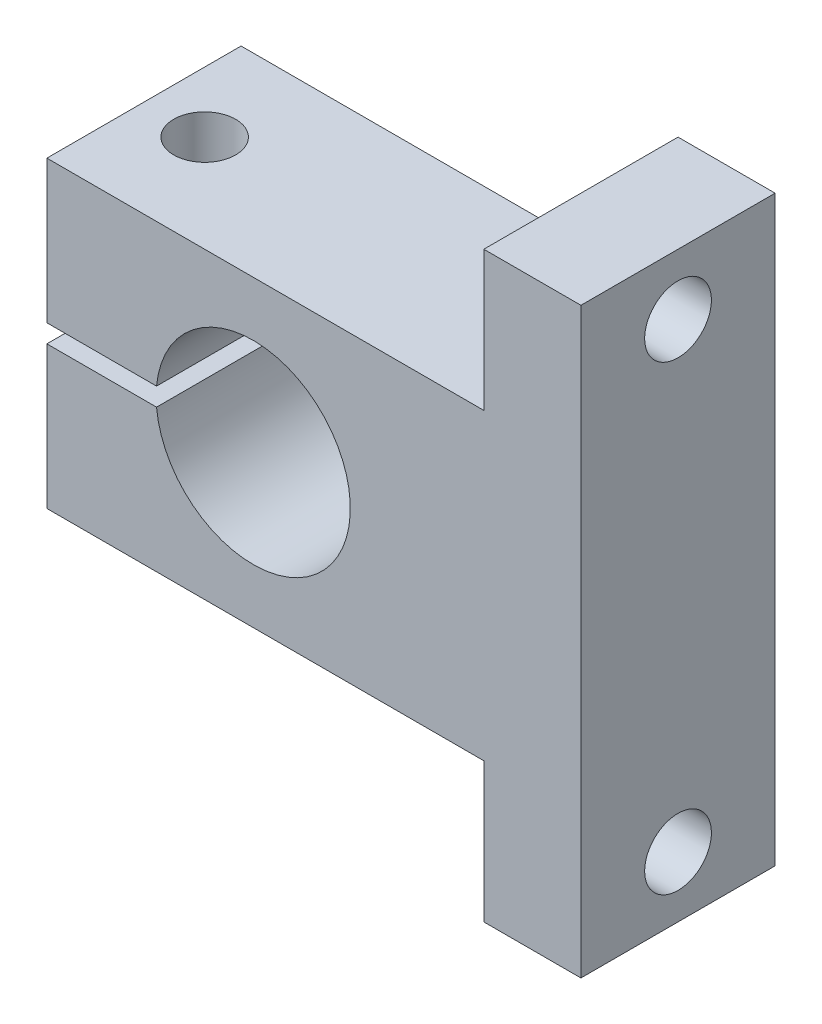
ISO-10303-21;
HEADER;
FILE_DESCRIPTION(('STEP AP214'),'2;1');
FILE_NAME('part.step','',(''),(''),'','','');
FILE_SCHEMA(('AUTOMOTIVE_DESIGN { 1 0 10303 214 1 1 1 1 }'));
ENDSEC;
DATA;
#1=APPLICATION_CONTEXT('core data for automotive mechanical design processes');
#2=APPLICATION_PROTOCOL_DEFINITION('international standard','automotive_design',2000,#1);
#3=PRODUCT_CONTEXT('',#1,'mechanical');
#4=PRODUCT('Part','Part','',(#3));
#5=PRODUCT_RELATED_PRODUCT_CATEGORY('part','',(#4));
#6=PRODUCT_DEFINITION_FORMATION('','',#4);
#7=PRODUCT_DEFINITION_CONTEXT('part definition',#1,'design');
#8=PRODUCT_DEFINITION('design','',#6,#7);
#9=PRODUCT_DEFINITION_SHAPE('','',#8);
#10=(LENGTH_UNIT() NAMED_UNIT(*) SI_UNIT(.MILLI.,.METRE.));
#11=(NAMED_UNIT(*) PLANE_ANGLE_UNIT() SI_UNIT($,.RADIAN.));
#12=(NAMED_UNIT(*) SI_UNIT($,.STERADIAN.) SOLID_ANGLE_UNIT());
#13=UNCERTAINTY_MEASURE_WITH_UNIT(LENGTH_MEASURE(1.E-05),#10,'distance_accuracy_value','');
#14=(GEOMETRIC_REPRESENTATION_CONTEXT(3) GLOBAL_UNCERTAINTY_ASSIGNED_CONTEXT((#13)) GLOBAL_UNIT_ASSIGNED_CONTEXT((#10,
#11,#12)) REPRESENTATION_CONTEXT('',''));
#15=CARTESIAN_POINT('',(0.,0.,0.));
#16=DIRECTION('',(0.,0.,1.));
#17=DIRECTION('',(1.,0.,0.));
#18=AXIS2_PLACEMENT_3D('',#15,#16,#17);
#19=CARTESIAN_POINT('',(-8.,0.,16.));
#20=DIRECTION('',(0.,1.,0.));
#21=DIRECTION('',(0.,0.,1.));
#22=AXIS2_PLACEMENT_3D('',#19,#20,#21);
#23=PLANE('',#22);
#24=DIRECTION('',(1.,0.,0.));
#25=VECTOR('',#24,1.);
#26=CARTESIAN_POINT('',(-8.,0.,0.));
#27=LINE('',#26,#25);
#28=CARTESIAN_POINT('',(-8.,0.,0.));
#29=VERTEX_POINT('',#28);
#30=CARTESIAN_POINT('',(0.,0.,0.));
#31=VERTEX_POINT('',#30);
#32=EDGE_CURVE('E170',#29,#31,#27,.T.);
#33=ORIENTED_EDGE('',*,*,#32,.T.);
#34=DIRECTION('',(0.,0.,-1.));
#35=VECTOR('',#34,1.);
#36=CARTESIAN_POINT('',(0.,0.,16.));
#37=LINE('',#36,#35);
#38=CARTESIAN_POINT('',(0.,0.,16.));
#39=VERTEX_POINT('',#38);
#40=EDGE_CURVE('E11',#39,#31,#37,.T.);
#41=ORIENTED_EDGE('',*,*,#40,.F.);
#42=DIRECTION('',(1.,0.,0.));
#43=VECTOR('',#42,1.);
#44=CARTESIAN_POINT('',(-8.,0.,16.));
#45=LINE('',#44,#43);
#46=CARTESIAN_POINT('',(-8.,0.,16.));
#47=VERTEX_POINT('',#46);
#48=EDGE_CURVE('E205',#47,#39,#45,.T.);
#49=ORIENTED_EDGE('',*,*,#48,.F.);
#50=DIRECTION('',(0.,0.,-1.));
#51=VECTOR('',#50,1.);
#52=CARTESIAN_POINT('',(-8.,0.,16.));
#53=LINE('',#52,#51);
#54=EDGE_CURVE('E166',#47,#29,#53,.T.);
#55=ORIENTED_EDGE('',*,*,#54,.T.);
#56=EDGE_LOOP('',(#33,#41,#49,#55));
#57=FACE_BOUND('',#56,.T.);
#58=ADVANCED_FACE('F45',(#57),#23,.F.);
#59=CARTESIAN_POINT('',(0.,0.,16.));
#60=DIRECTION('',(-1.,0.,0.));
#61=DIRECTION('',(0.,0.,1.));
#62=AXIS2_PLACEMENT_3D('',#59,#60,#61);
#63=PLANE('',#62);
#64=CARTESIAN_POINT('',(0.,5.,8.));
#65=DIRECTION('',(-1.,0.,0.));
#66=DIRECTION('',(0.,-1.,0.));
#67=AXIS2_PLACEMENT_3D('',#64,#65,#66);
#68=CIRCLE('',#67,2.75);
#69=CARTESIAN_POINT('',(0.,2.25,8.));
#70=VERTEX_POINT('',#69);
#71=EDGE_CURVE('E488',#70,#70,#68,.T.);
#72=ORIENTED_EDGE('',*,*,#71,.T.);
#73=EDGE_LOOP('',(#72));
#74=FACE_BOUND('',#73,.T.);
#75=CARTESIAN_POINT('',(0.,43.,8.));
#76=DIRECTION('',(-1.,0.,0.));
#77=DIRECTION('',(0.,-1.,0.));
#78=AXIS2_PLACEMENT_3D('',#75,#76,#77);
#79=CIRCLE('',#78,2.75);
#80=CARTESIAN_POINT('',(0.,40.25,8.));
#81=VERTEX_POINT('',#80);
#82=EDGE_CURVE('E483',#81,#81,#79,.T.);
#83=ORIENTED_EDGE('',*,*,#82,.T.);
#84=EDGE_LOOP('',(#83));
#85=FACE_BOUND('',#84,.T.);
#86=DIRECTION('',(0.,1.,0.));
#87=VECTOR('',#86,1.);
#88=CARTESIAN_POINT('',(0.,0.,0.));
#89=LINE('',#88,#87);
#90=CARTESIAN_POINT('',(0.,48.,0.));
#91=VERTEX_POINT('',#90);
#92=EDGE_CURVE('E174',#31,#91,#89,.T.);
#93=ORIENTED_EDGE('',*,*,#92,.T.);
#94=DIRECTION('',(0.,0.,-1.));
#95=VECTOR('',#94,1.);
#96=CARTESIAN_POINT('',(0.,48.,16.));
#97=LINE('',#96,#95);
#98=CARTESIAN_POINT('',(0.,48.,16.));
#99=VERTEX_POINT('',#98);
#100=EDGE_CURVE('E54',#99,#91,#97,.T.);
#101=ORIENTED_EDGE('',*,*,#100,.F.);
#102=DIRECTION('',(0.,1.,0.));
#103=VECTOR('',#102,1.);
#104=CARTESIAN_POINT('',(0.,0.,16.));
#105=LINE('',#104,#103);
#106=EDGE_CURVE('E117',#39,#99,#105,.T.);
#107=ORIENTED_EDGE('',*,*,#106,.F.);
#108=ORIENTED_EDGE('',*,*,#40,.T.);
#109=EDGE_LOOP('',(#93,#101,#107,#108));
#110=FACE_BOUND('',#109,.T.);
#111=ADVANCED_FACE('F302',(#74,#85,#110),#63,.F.);
#112=CARTESIAN_POINT('',(0.,48.,16.));
#113=DIRECTION('',(0.,-1.,0.));
#114=DIRECTION('',(0.,0.,-1.));
#115=AXIS2_PLACEMENT_3D('',#112,#113,#114);
#116=PLANE('',#115);
#117=DIRECTION('',(-1.,0.,0.));
#118=VECTOR('',#117,1.);
#119=CARTESIAN_POINT('',(0.,48.,0.));
#120=LINE('',#119,#118);
#121=CARTESIAN_POINT('',(-8.,48.,0.));
#122=VERTEX_POINT('',#121);
#123=EDGE_CURVE('E178',#91,#122,#120,.T.);
#124=ORIENTED_EDGE('',*,*,#123,.T.);
#125=DIRECTION('',(0.,0.,-1.));
#126=VECTOR('',#125,1.);
#127=CARTESIAN_POINT('',(-8.,48.,16.));
#128=LINE('',#127,#126);
#129=CARTESIAN_POINT('',(-8.,48.,16.));
#130=VERTEX_POINT('',#129);
#131=EDGE_CURVE('E232',#130,#122,#128,.T.);
#132=ORIENTED_EDGE('',*,*,#131,.F.);
#133=DIRECTION('',(-1.,0.,0.));
#134=VECTOR('',#133,1.);
#135=CARTESIAN_POINT('',(0.,48.,16.));
#136=LINE('',#135,#134);
#137=EDGE_CURVE('E242',#99,#130,#136,.T.);
#138=ORIENTED_EDGE('',*,*,#137,.F.);
#139=ORIENTED_EDGE('',*,*,#100,.T.);
#140=EDGE_LOOP('',(#124,#132,#138,#139));
#141=FACE_BOUND('',#140,.T.);
#142=ADVANCED_FACE('F240',(#141),#116,.F.);
#143=CARTESIAN_POINT('',(-8.,48.,16.));
#144=DIRECTION('',(1.,0.,0.));
#145=DIRECTION('',(0.,1.,0.));
#146=AXIS2_PLACEMENT_3D('',#143,#144,#145);
#147=PLANE('',#146);
#148=CARTESIAN_POINT('',(-8.00000000000001,43.,8.));
#149=DIRECTION('',(-1.,0.,0.));
#150=DIRECTION('',(0.,-1.,0.));
#151=AXIS2_PLACEMENT_3D('',#148,#149,#150);
#152=CIRCLE('',#151,2.75);
#153=CARTESIAN_POINT('',(-8.00000000000001,40.25,8.));
#154=VERTEX_POINT('',#153);
#155=EDGE_CURVE('E484',#154,#154,#152,.T.);
#156=ORIENTED_EDGE('',*,*,#155,.F.);
#157=EDGE_LOOP('',(#156));
#158=FACE_BOUND('',#157,.T.);
#159=DIRECTION('',(0.,-1.,0.));
#160=VECTOR('',#159,1.);
#161=CARTESIAN_POINT('',(-8.,48.,0.));
#162=LINE('',#161,#160);
#163=CARTESIAN_POINT('',(-8.,36.5,0.));
#164=VERTEX_POINT('',#163);
#165=EDGE_CURVE('E181',#122,#164,#162,.T.);
#166=ORIENTED_EDGE('',*,*,#165,.T.);
#167=DIRECTION('',(0.,0.,-1.));
#168=VECTOR('',#167,1.);
#169=CARTESIAN_POINT('',(-8.,36.5,16.));
#170=LINE('',#169,#168);
#171=CARTESIAN_POINT('',(-8.,36.5,16.));
#172=VERTEX_POINT('',#171);
#173=EDGE_CURVE('E228',#172,#164,#170,.T.);
#174=ORIENTED_EDGE('',*,*,#173,.F.);
#175=DIRECTION('',(0.,-1.,0.));
#176=VECTOR('',#175,1.);
#177=CARTESIAN_POINT('',(-8.,48.,16.));
#178=LINE('',#177,#176);
#179=EDGE_CURVE('E261',#130,#172,#178,.T.);
#180=ORIENTED_EDGE('',*,*,#179,.F.);
#181=ORIENTED_EDGE('',*,*,#131,.T.);
#182=EDGE_LOOP('',(#166,#174,#180,#181));
#183=FACE_BOUND('',#182,.T.);
#184=ADVANCED_FACE('F251',(#158,#183),#147,.F.);
#185=CARTESIAN_POINT('',(-8.,36.5,16.));
#186=DIRECTION('',(0.,-1.,0.));
#187=DIRECTION('',(0.,0.,-1.));
#188=AXIS2_PLACEMENT_3D('',#185,#186,#187);
#189=PLANE('',#188);
#190=CARTESIAN_POINT('',(-39.,36.5,8.));
#191=DIRECTION('',(0.,1.,0.));
#192=DIRECTION('',(0.,0.,1.));
#193=AXIS2_PLACEMENT_3D('',#190,#191,#192);
#194=CIRCLE('',#193,2.55);
#195=CARTESIAN_POINT('',(-39.,36.5,10.55));
#196=VERTEX_POINT('',#195);
#197=EDGE_CURVE('E462',#196,#196,#194,.T.);
#198=ORIENTED_EDGE('',*,*,#197,.F.);
#199=EDGE_LOOP('',(#198));
#200=FACE_BOUND('',#199,.T.);
#201=DIRECTION('',(-1.,0.,0.));
#202=VECTOR('',#201,1.);
#203=CARTESIAN_POINT('',(-8.,36.5,0.));
#204=LINE('',#203,#202);
#205=CARTESIAN_POINT('',(-44.,36.5,0.));
#206=VERTEX_POINT('',#205);
#207=EDGE_CURVE('E184',#164,#206,#204,.T.);
#208=ORIENTED_EDGE('',*,*,#207,.T.);
#209=DIRECTION('',(0.,0.,-1.));
#210=VECTOR('',#209,1.);
#211=CARTESIAN_POINT('',(-44.,36.5,16.));
#212=LINE('',#211,#210);
#213=CARTESIAN_POINT('',(-44.,36.5,16.));
#214=VERTEX_POINT('',#213);
#215=EDGE_CURVE('E224',#214,#206,#212,.T.);
#216=ORIENTED_EDGE('',*,*,#215,.F.);
#217=DIRECTION('',(-1.,0.,0.));
#218=VECTOR('',#217,1.);
#219=CARTESIAN_POINT('',(-8.,36.5,16.));
#220=LINE('',#219,#218);
#221=EDGE_CURVE('E257',#172,#214,#220,.T.);
#222=ORIENTED_EDGE('',*,*,#221,.F.);
#223=ORIENTED_EDGE('',*,*,#173,.T.);
#224=EDGE_LOOP('',(#208,#216,#222,#223));
#225=FACE_BOUND('',#224,.T.);
#226=ADVANCED_FACE('F255',(#200,#225),#189,.F.);
#227=CARTESIAN_POINT('',(-44.,36.5,16.));
#228=DIRECTION('',(1.,0.,0.));
#229=DIRECTION('',(0.,0.,-1.));
#230=AXIS2_PLACEMENT_3D('',#227,#228,#229);
#231=PLANE('',#230);
#232=DIRECTION('',(0.,-1.,0.));
#233=VECTOR('',#232,1.);
#234=CARTESIAN_POINT('',(-44.,36.5,0.));
#235=LINE('',#234,#233);
#236=CARTESIAN_POINT('',(-44.,24.75,0.));
#237=VERTEX_POINT('',#236);
#238=EDGE_CURVE('E187',#206,#237,#235,.T.);
#239=ORIENTED_EDGE('',*,*,#238,.T.);
#240=DIRECTION('',(0.,0.,-1.));
#241=VECTOR('',#240,1.);
#242=CARTESIAN_POINT('',(-44.,24.75,16.));
#243=LINE('',#242,#241);
#244=CARTESIAN_POINT('',(-44.,24.75,16.));
#245=VERTEX_POINT('',#244);
#246=EDGE_CURVE('E220',#245,#237,#243,.T.);
#247=ORIENTED_EDGE('',*,*,#246,.F.);
#248=DIRECTION('',(0.,-1.,0.));
#249=VECTOR('',#248,1.);
#250=CARTESIAN_POINT('',(-44.,36.5,16.));
#251=LINE('',#250,#249);
#252=EDGE_CURVE('E260',#214,#245,#251,.T.);
#253=ORIENTED_EDGE('',*,*,#252,.F.);
#254=ORIENTED_EDGE('',*,*,#215,.T.);
#255=EDGE_LOOP('',(#239,#247,#253,#254));
#256=FACE_BOUND('',#255,.T.);
#257=ADVANCED_FACE('F319',(#256),#231,.F.);
#258=CARTESIAN_POINT('',(-44.,24.75,16.));
#259=DIRECTION('',(0.,1.,0.));
#260=DIRECTION('',(-1.,0.,0.));
#261=AXIS2_PLACEMENT_3D('',#258,#259,#260);
#262=PLANE('',#261);
#263=CARTESIAN_POINT('',(-39.,24.75,8.));
#264=DIRECTION('',(0.,1.,0.));
#265=DIRECTION('',(-1.,0.,0.));
#266=AXIS2_PLACEMENT_3D('',#263,#264,#265);
#267=CIRCLE('',#266,2.55);
#268=CARTESIAN_POINT('',(-41.55,24.75,8.));
#269=VERTEX_POINT('',#268);
#270=EDGE_CURVE('E175',#269,#269,#267,.F.);
#271=ORIENTED_EDGE('',*,*,#270,.F.);
#272=EDGE_LOOP('',(#271));
#273=FACE_BOUND('',#272,.T.);
#274=DIRECTION('',(1.,0.,0.));
#275=VECTOR('',#274,1.);
#276=CARTESIAN_POINT('',(-44.,24.75,0.));
#277=LINE('',#276,#275);
#278=CARTESIAN_POINT('',(-34.964766161037,24.75,0.));
#279=VERTEX_POINT('',#278);
#280=EDGE_CURVE('E190',#237,#279,#277,.T.);
#281=ORIENTED_EDGE('',*,*,#280,.T.);
#282=DIRECTION('',(0.,0.,-1.));
#283=VECTOR('',#282,1.);
#284=CARTESIAN_POINT('',(-34.964766161037,24.75,16.));
#285=LINE('',#284,#283);
#286=CARTESIAN_POINT('',(-34.964766161037,24.75,16.));
#287=VERTEX_POINT('',#286);
#288=EDGE_CURVE('E216',#287,#279,#285,.T.);
#289=ORIENTED_EDGE('',*,*,#288,.F.);
#290=DIRECTION('',(1.,0.,0.));
#291=VECTOR('',#290,1.);
#292=CARTESIAN_POINT('',(-44.,24.75,16.));
#293=LINE('',#292,#291);
#294=EDGE_CURVE('E265',#245,#287,#293,.T.);
#295=ORIENTED_EDGE('',*,*,#294,.F.);
#296=ORIENTED_EDGE('',*,*,#246,.T.);
#297=EDGE_LOOP('',(#281,#289,#295,#296));
#298=FACE_BOUND('',#297,.T.);
#299=ADVANCED_FACE('F323',(#273,#298),#262,.F.);
#300=CARTESIAN_POINT('',(-27.,24.,16.));
#301=DIRECTION('',(0.,0.,-1.));
#302=DIRECTION('',(-1.,0.,0.));
#303=AXIS2_PLACEMENT_3D('',#300,#301,#302);
#304=CYLINDRICAL_SURFACE('',#303,8.);
#305=CARTESIAN_POINT('',(-27.,24.,0.));
#306=DIRECTION('',(0.,0.,-1.));
#307=DIRECTION('',(1.,0.,0.));
#308=AXIS2_PLACEMENT_3D('',#305,#306,#307);
#309=CIRCLE('',#308,8.);
#310=CARTESIAN_POINT('',(-34.964766161037,23.25,0.));
#311=VERTEX_POINT('',#310);
#312=EDGE_CURVE('E193',#279,#311,#309,.T.);
#313=ORIENTED_EDGE('',*,*,#312,.T.);
#314=DIRECTION('',(0.,0.,-1.));
#315=VECTOR('',#314,1.);
#316=CARTESIAN_POINT('',(-34.964766161037,23.25,16.));
#317=LINE('',#316,#315);
#318=CARTESIAN_POINT('',(-34.964766161037,23.25,16.));
#319=VERTEX_POINT('',#318);
#320=EDGE_CURVE('E212',#319,#311,#317,.T.);
#321=ORIENTED_EDGE('',*,*,#320,.F.);
#322=CARTESIAN_POINT('',(-27.,24.,16.));
#323=DIRECTION('',(0.,0.,-1.));
#324=DIRECTION('',(1.,0.,0.));
#325=AXIS2_PLACEMENT_3D('',#322,#323,#324);
#326=CIRCLE('',#325,8.);
#327=EDGE_CURVE('E272',#287,#319,#326,.T.);
#328=ORIENTED_EDGE('',*,*,#327,.F.);
#329=ORIENTED_EDGE('',*,*,#288,.T.);
#330=EDGE_LOOP('',(#313,#321,#328,#329));
#331=FACE_BOUND('',#330,.T.);
#332=ADVANCED_FACE('F280',(#331),#304,.F.);
#333=CARTESIAN_POINT('',(-44.,23.25,16.));
#334=DIRECTION('',(0.,-1.,0.));
#335=DIRECTION('',(1.,0.,0.));
#336=AXIS2_PLACEMENT_3D('',#333,#334,#335);
#337=PLANE('',#336);
#338=CARTESIAN_POINT('',(-39.,23.25,8.));
#339=DIRECTION('',(0.,1.,0.));
#340=DIRECTION('',(0.,0.,1.));
#341=AXIS2_PLACEMENT_3D('',#338,#339,#340);
#342=CIRCLE('',#341,2.09999999999999);
#343=CARTESIAN_POINT('',(-39.,23.25,10.1));
#344=VERTEX_POINT('',#343);
#345=EDGE_CURVE('E479',#344,#344,#342,.T.);
#346=ORIENTED_EDGE('',*,*,#345,.F.);
#347=EDGE_LOOP('',(#346));
#348=FACE_BOUND('',#347,.T.);
#349=DIRECTION('',(-1.,0.,0.));
#350=VECTOR('',#349,1.);
#351=CARTESIAN_POINT('',(-44.,23.25,0.));
#352=LINE('',#351,#350);
#353=CARTESIAN_POINT('',(-44.,23.25,0.));
#354=VERTEX_POINT('',#353);
#355=EDGE_CURVE('E196',#311,#354,#352,.T.);
#356=ORIENTED_EDGE('',*,*,#355,.T.);
#357=DIRECTION('',(0.,0.,-1.));
#358=VECTOR('',#357,1.);
#359=CARTESIAN_POINT('',(-44.,23.25,16.));
#360=LINE('',#359,#358);
#361=CARTESIAN_POINT('',(-44.,23.25,16.));
#362=VERTEX_POINT('',#361);
#363=EDGE_CURVE('E159',#362,#354,#360,.T.);
#364=ORIENTED_EDGE('',*,*,#363,.F.);
#365=DIRECTION('',(-1.,0.,0.));
#366=VECTOR('',#365,1.);
#367=CARTESIAN_POINT('',(-44.,23.25,16.));
#368=LINE('',#367,#366);
#369=EDGE_CURVE('E148',#319,#362,#368,.T.);
#370=ORIENTED_EDGE('',*,*,#369,.F.);
#371=ORIENTED_EDGE('',*,*,#320,.T.);
#372=EDGE_LOOP('',(#356,#364,#370,#371));
#373=FACE_BOUND('',#372,.T.);
#374=ADVANCED_FACE('F284',(#348,#373),#337,.F.);
#375=CARTESIAN_POINT('',(-44.,23.25,16.));
#376=DIRECTION('',(1.,0.,0.));
#377=DIRECTION('',(0.,0.,-1.));
#378=AXIS2_PLACEMENT_3D('',#375,#376,#377);
#379=PLANE('',#378);
#380=DIRECTION('',(0.,-1.,0.));
#381=VECTOR('',#380,1.);
#382=CARTESIAN_POINT('',(-44.,23.25,0.));
#383=LINE('',#382,#381);
#384=CARTESIAN_POINT('',(-44.,11.5,0.));
#385=VERTEX_POINT('',#384);
#386=EDGE_CURVE('E157',#354,#385,#383,.T.);
#387=ORIENTED_EDGE('',*,*,#386,.T.);
#388=DIRECTION('',(0.,0.,-1.));
#389=VECTOR('',#388,1.);
#390=CARTESIAN_POINT('',(-44.,11.5,16.));
#391=LINE('',#390,#389);
#392=CARTESIAN_POINT('',(-44.,11.5,16.));
#393=VERTEX_POINT('',#392);
#394=EDGE_CURVE('E154',#393,#385,#391,.T.);
#395=ORIENTED_EDGE('',*,*,#394,.F.);
#396=DIRECTION('',(0.,-1.,0.));
#397=VECTOR('',#396,1.);
#398=CARTESIAN_POINT('',(-44.,23.25,16.));
#399=LINE('',#398,#397);
#400=EDGE_CURVE('E142',#362,#393,#399,.T.);
#401=ORIENTED_EDGE('',*,*,#400,.F.);
#402=ORIENTED_EDGE('',*,*,#363,.T.);
#403=EDGE_LOOP('',(#387,#395,#401,#402));
#404=FACE_BOUND('',#403,.T.);
#405=ADVANCED_FACE('F155',(#404),#379,.F.);
#406=CARTESIAN_POINT('',(-44.,11.5,16.));
#407=DIRECTION('',(0.,1.,0.));
#408=DIRECTION('',(0.,0.,1.));
#409=AXIS2_PLACEMENT_3D('',#406,#407,#408);
#410=PLANE('',#409);
#411=CARTESIAN_POINT('',(-39.,11.5,8.));
#412=DIRECTION('',(0.,1.,0.));
#413=DIRECTION('',(0.,0.,1.));
#414=AXIS2_PLACEMENT_3D('',#411,#412,#413);
#415=CIRCLE('',#414,2.09999999999999);
#416=CARTESIAN_POINT('',(-39.,11.5,10.1));
#417=VERTEX_POINT('',#416);
#418=EDGE_CURVE('E468',#417,#417,#415,.T.);
#419=ORIENTED_EDGE('',*,*,#418,.T.);
#420=EDGE_LOOP('',(#419));
#421=FACE_BOUND('',#420,.T.);
#422=DIRECTION('',(1.,0.,0.));
#423=VECTOR('',#422,1.);
#424=CARTESIAN_POINT('',(-44.,11.5,0.));
#425=LINE('',#424,#423);
#426=CARTESIAN_POINT('',(-8.,11.5,0.));
#427=VERTEX_POINT('',#426);
#428=EDGE_CURVE('E103',#385,#427,#425,.T.);
#429=ORIENTED_EDGE('',*,*,#428,.T.);
#430=DIRECTION('',(0.,0.,-1.));
#431=VECTOR('',#430,1.);
#432=CARTESIAN_POINT('',(-8.,11.5,16.));
#433=LINE('',#432,#431);
#434=CARTESIAN_POINT('',(-8.,11.5,16.));
#435=VERTEX_POINT('',#434);
#436=EDGE_CURVE('E160',#435,#427,#433,.T.);
#437=ORIENTED_EDGE('',*,*,#436,.F.);
#438=DIRECTION('',(1.,0.,0.));
#439=VECTOR('',#438,1.);
#440=CARTESIAN_POINT('',(-44.,11.5,16.));
#441=LINE('',#440,#439);
#442=EDGE_CURVE('E146',#393,#435,#441,.T.);
#443=ORIENTED_EDGE('',*,*,#442,.F.);
#444=ORIENTED_EDGE('',*,*,#394,.T.);
#445=EDGE_LOOP('',(#429,#437,#443,#444));
#446=FACE_BOUND('',#445,.T.);
#447=ADVANCED_FACE('F162',(#421,#446),#410,.F.);
#448=CARTESIAN_POINT('',(-8.,11.5,16.));
#449=DIRECTION('',(1.,0.,0.));
#450=DIRECTION('',(0.,0.,-1.));
#451=AXIS2_PLACEMENT_3D('',#448,#449,#450);
#452=PLANE('',#451);
#453=CARTESIAN_POINT('',(-8.,5.,8.));
#454=DIRECTION('',(-1.,0.,0.));
#455=DIRECTION('',(0.,-1.,0.));
#456=AXIS2_PLACEMENT_3D('',#453,#454,#455);
#457=CIRCLE('',#456,2.75);
#458=CARTESIAN_POINT('',(-8.,2.25,8.));
#459=VERTEX_POINT('',#458);
#460=EDGE_CURVE('E492',#459,#459,#457,.T.);
#461=ORIENTED_EDGE('',*,*,#460,.F.);
#462=EDGE_LOOP('',(#461));
#463=FACE_BOUND('',#462,.T.);
#464=DIRECTION('',(0.,-1.,0.));
#465=VECTOR('',#464,1.);
#466=CARTESIAN_POINT('',(-8.,11.5,0.));
#467=LINE('',#466,#465);
#468=EDGE_CURVE('E109',#427,#29,#467,.T.);
#469=ORIENTED_EDGE('',*,*,#468,.T.);
#470=ORIENTED_EDGE('',*,*,#54,.F.);
#471=DIRECTION('',(0.,-1.,0.));
#472=VECTOR('',#471,1.);
#473=CARTESIAN_POINT('',(-8.,11.5,16.));
#474=LINE('',#473,#472);
#475=EDGE_CURVE('E62',#435,#47,#474,.T.);
#476=ORIENTED_EDGE('',*,*,#475,.F.);
#477=ORIENTED_EDGE('',*,*,#436,.T.);
#478=EDGE_LOOP('',(#469,#470,#476,#477));
#479=FACE_BOUND('',#478,.T.);
#480=ADVANCED_FACE('F288',(#463,#479),#452,.F.);
#481=CARTESIAN_POINT('',(-27.,24.,16.));
#482=DIRECTION('',(0.,0.,1.));
#483=DIRECTION('',(1.,0.,0.));
#484=AXIS2_PLACEMENT_3D('',#481,#482,#483);
#485=PLANE('',#484);
#486=ORIENTED_EDGE('',*,*,#48,.T.);
#487=ORIENTED_EDGE('',*,*,#106,.T.);
#488=ORIENTED_EDGE('',*,*,#137,.T.);
#489=ORIENTED_EDGE('',*,*,#179,.T.);
#490=ORIENTED_EDGE('',*,*,#221,.T.);
#491=ORIENTED_EDGE('',*,*,#252,.T.);
#492=ORIENTED_EDGE('',*,*,#294,.T.);
#493=ORIENTED_EDGE('',*,*,#327,.T.);
#494=ORIENTED_EDGE('',*,*,#369,.T.);
#495=ORIENTED_EDGE('',*,*,#400,.T.);
#496=ORIENTED_EDGE('',*,*,#442,.T.);
#497=ORIENTED_EDGE('',*,*,#475,.T.);
#498=EDGE_LOOP('',(#486,#487,#488,#489,#490,#491,#492,#493,#494,#495,#496,#497));
#499=FACE_BOUND('',#498,.T.);
#500=ADVANCED_FACE('F144',(#499),#485,.T.);
#501=CARTESIAN_POINT('',(-27.,24.,0.));
#502=DIRECTION('',(0.,0.,1.));
#503=DIRECTION('',(1.,0.,0.));
#504=AXIS2_PLACEMENT_3D('',#501,#502,#503);
#505=PLANE('',#504);
#506=ORIENTED_EDGE('',*,*,#32,.F.);
#507=ORIENTED_EDGE('',*,*,#468,.F.);
#508=ORIENTED_EDGE('',*,*,#428,.F.);
#509=ORIENTED_EDGE('',*,*,#386,.F.);
#510=ORIENTED_EDGE('',*,*,#355,.F.);
#511=ORIENTED_EDGE('',*,*,#312,.F.);
#512=ORIENTED_EDGE('',*,*,#280,.F.);
#513=ORIENTED_EDGE('',*,*,#238,.F.);
#514=ORIENTED_EDGE('',*,*,#207,.F.);
#515=ORIENTED_EDGE('',*,*,#165,.F.);
#516=ORIENTED_EDGE('',*,*,#123,.F.);
#517=ORIENTED_EDGE('',*,*,#92,.F.);
#518=EDGE_LOOP('',(#506,#507,#508,#509,#510,#511,#512,#513,#514,#515,#516,#517));
#519=FACE_BOUND('',#518,.T.);
#520=ADVANCED_FACE('F246',(#519),#505,.F.);
#521=CARTESIAN_POINT('',(-39.,-0.001000000000001,8.));
#522=DIRECTION('',(0.,1.,0.));
#523=DIRECTION('',(0.,0.,1.));
#524=AXIS2_PLACEMENT_3D('',#521,#522,#523);
#525=CYLINDRICAL_SURFACE('',#524,2.55);
#526=ORIENTED_EDGE('',*,*,#197,.T.);
#527=EDGE_LOOP('',(#526));
#528=FACE_BOUND('',#527,.T.);
#529=ORIENTED_EDGE('',*,*,#270,.T.);
#530=EDGE_LOOP('',(#529));
#531=FACE_BOUND('',#530,.T.);
#532=ADVANCED_FACE('F359',(#528,#531),#525,.F.);
#533=CARTESIAN_POINT('',(-39.,23.25,8.));
#534=DIRECTION('',(0.,1.,0.));
#535=DIRECTION('',(0.,0.,1.));
#536=AXIS2_PLACEMENT_3D('',#533,#534,#535);
#537=CYLINDRICAL_SURFACE('',#536,2.09999999999999);
#538=ORIENTED_EDGE('',*,*,#345,.T.);
#539=EDGE_LOOP('',(#538));
#540=FACE_BOUND('',#539,.T.);
#541=ORIENTED_EDGE('',*,*,#418,.F.);
#542=EDGE_LOOP('',(#541));
#543=FACE_BOUND('',#542,.T.);
#544=ADVANCED_FACE('F353',(#540,#543),#537,.F.);
#545=CARTESIAN_POINT('',(0.,43.,8.));
#546=DIRECTION('',(-1.,0.,0.));
#547=DIRECTION('',(0.,-1.,0.));
#548=AXIS2_PLACEMENT_3D('',#545,#546,#547);
#549=CYLINDRICAL_SURFACE('',#548,2.75);
#550=ORIENTED_EDGE('',*,*,#82,.F.);
#551=EDGE_LOOP('',(#550));
#552=FACE_BOUND('',#551,.T.);
#553=ORIENTED_EDGE('',*,*,#155,.T.);
#554=EDGE_LOOP('',(#553));
#555=FACE_BOUND('',#554,.T.);
#556=ADVANCED_FACE('F358',(#552,#555),#549,.F.);
#557=CARTESIAN_POINT('',(0.,5.,8.));
#558=DIRECTION('',(-1.,0.,0.));
#559=DIRECTION('',(0.,-1.,0.));
#560=AXIS2_PLACEMENT_3D('',#557,#558,#559);
#561=CYLINDRICAL_SURFACE('',#560,2.75);
#562=ORIENTED_EDGE('',*,*,#71,.F.);
#563=EDGE_LOOP('',(#562));
#564=FACE_BOUND('',#563,.T.);
#565=ORIENTED_EDGE('',*,*,#460,.T.);
#566=EDGE_LOOP('',(#565));
#567=FACE_BOUND('',#566,.T.);
#568=ADVANCED_FACE('F389',(#564,#567),#561,.F.);
#569=CLOSED_SHELL('',(#58,#111,#142,#184,#226,#257,#299,#332,#374,#405,#447,#480,#500,#520,#532,
#544,#556,#568));
#570=MANIFOLD_SOLID_BREP('B2',#569);
#571=ADVANCED_BREP_SHAPE_REPRESENTATION('',(#18,#570),#14);
#572=SHAPE_DEFINITION_REPRESENTATION(#9,#571);
ENDSEC;
END-ISO-10303-21;
